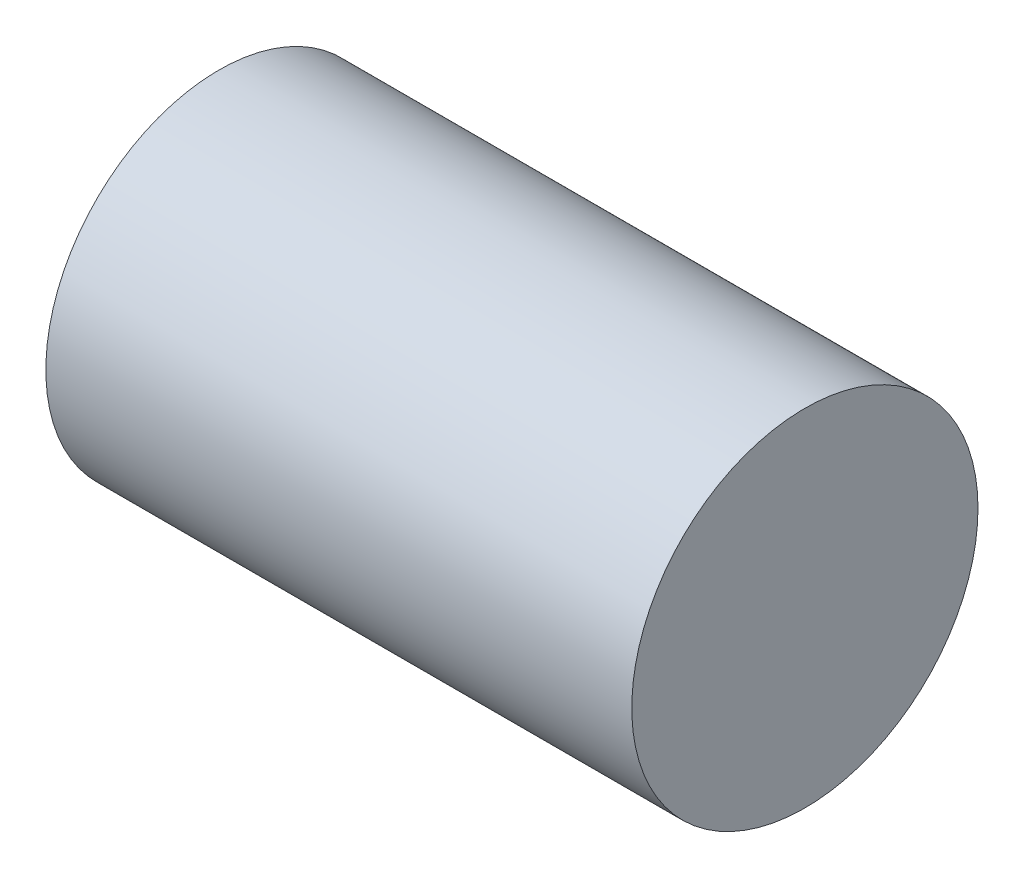
ISO-10303-21;
HEADER;
FILE_DESCRIPTION(('STEP AP214'),'2;1');
FILE_NAME('part.step','',(''),(''),'','','');
FILE_SCHEMA(('AUTOMOTIVE_DESIGN { 1 0 10303 214 1 1 1 1 }'));
ENDSEC;
DATA;
#1=APPLICATION_CONTEXT('core data for automotive mechanical design processes');
#2=APPLICATION_PROTOCOL_DEFINITION('international standard','automotive_design',2000,#1);
#3=PRODUCT_CONTEXT('',#1,'mechanical');
#4=PRODUCT('Part','Part','',(#3));
#5=PRODUCT_RELATED_PRODUCT_CATEGORY('part','',(#4));
#6=PRODUCT_DEFINITION_FORMATION('','',#4);
#7=PRODUCT_DEFINITION_CONTEXT('part definition',#1,'design');
#8=PRODUCT_DEFINITION('design','',#6,#7);
#9=PRODUCT_DEFINITION_SHAPE('','',#8);
#10=(LENGTH_UNIT() NAMED_UNIT(*) SI_UNIT(.MILLI.,.METRE.));
#11=(NAMED_UNIT(*) PLANE_ANGLE_UNIT() SI_UNIT($,.RADIAN.));
#12=(NAMED_UNIT(*) SI_UNIT($,.STERADIAN.) SOLID_ANGLE_UNIT());
#13=UNCERTAINTY_MEASURE_WITH_UNIT(LENGTH_MEASURE(1.E-05),#10,'distance_accuracy_value','');
#14=(GEOMETRIC_REPRESENTATION_CONTEXT(3) GLOBAL_UNCERTAINTY_ASSIGNED_CONTEXT((#13)) GLOBAL_UNIT_ASSIGNED_CONTEXT((#10,
#11,#12)) REPRESENTATION_CONTEXT('',''));
#15=CARTESIAN_POINT('',(0.,0.,0.));
#16=DIRECTION('',(0.,0.,1.));
#17=DIRECTION('',(1.,0.,0.));
#18=AXIS2_PLACEMENT_3D('',#15,#16,#17);
#19=CARTESIAN_POINT('',(22.,0.,0.));
#20=DIRECTION('',(-1.,0.,0.));
#21=DIRECTION('',(0.,0.,1.));
#22=AXIS2_PLACEMENT_3D('',#19,#20,#21);
#23=CYLINDRICAL_SURFACE('',#22,6.5);
#24=CARTESIAN_POINT('',(22.,0.,0.));
#25=DIRECTION('',(1.,0.,0.));
#26=DIRECTION('',(0.,0.,-1.));
#27=AXIS2_PLACEMENT_3D('',#24,#25,#26);
#28=CIRCLE('',#27,6.5);
#29=CARTESIAN_POINT('',(22.,0.,-6.5));
#30=VERTEX_POINT('',#29);
#31=EDGE_CURVE('E10',#30,#30,#28,.T.);
#32=ORIENTED_EDGE('',*,*,#31,.F.);
#33=EDGE_LOOP('',(#32));
#34=FACE_BOUND('',#33,.T.);
#35=CARTESIAN_POINT('',(0.,0.,0.));
#36=DIRECTION('',(1.,0.,0.));
#37=DIRECTION('',(0.,0.,-1.));
#38=AXIS2_PLACEMENT_3D('',#35,#36,#37);
#39=CIRCLE('',#38,6.5);
#40=CARTESIAN_POINT('',(0.,0.,-6.5));
#41=VERTEX_POINT('',#40);
#42=EDGE_CURVE('E46',#41,#41,#39,.T.);
#43=ORIENTED_EDGE('',*,*,#42,.T.);
#44=EDGE_LOOP('',(#43));
#45=FACE_BOUND('',#44,.T.);
#46=ADVANCED_FACE('F43',(#34,#45),#23,.T.);
#47=CARTESIAN_POINT('',(22.,0.,0.));
#48=DIRECTION('',(1.,0.,0.));
#49=DIRECTION('',(0.,0.,-1.));
#50=AXIS2_PLACEMENT_3D('',#47,#48,#49);
#51=PLANE('',#50);
#52=ORIENTED_EDGE('',*,*,#31,.T.);
#53=EDGE_LOOP('',(#52));
#54=FACE_BOUND('',#53,.T.);
#55=ADVANCED_FACE('F60',(#54),#51,.T.);
#56=CARTESIAN_POINT('',(0.,0.,0.));
#57=DIRECTION('',(1.,0.,0.));
#58=DIRECTION('',(0.,0.,-1.));
#59=AXIS2_PLACEMENT_3D('',#56,#57,#58);
#60=PLANE('',#59);
#61=ORIENTED_EDGE('',*,*,#42,.F.);
#62=EDGE_LOOP('',(#61));
#63=FACE_BOUND('',#62,.T.);
#64=ADVANCED_FACE('F58',(#63),#60,.F.);
#65=CLOSED_SHELL('',(#46,#55,#64));
#66=MANIFOLD_SOLID_BREP('B2',#65);
#67=ADVANCED_BREP_SHAPE_REPRESENTATION('',(#18,#66),#14);
#68=SHAPE_DEFINITION_REPRESENTATION(#9,#67);
ENDSEC;
END-ISO-10303-21;
